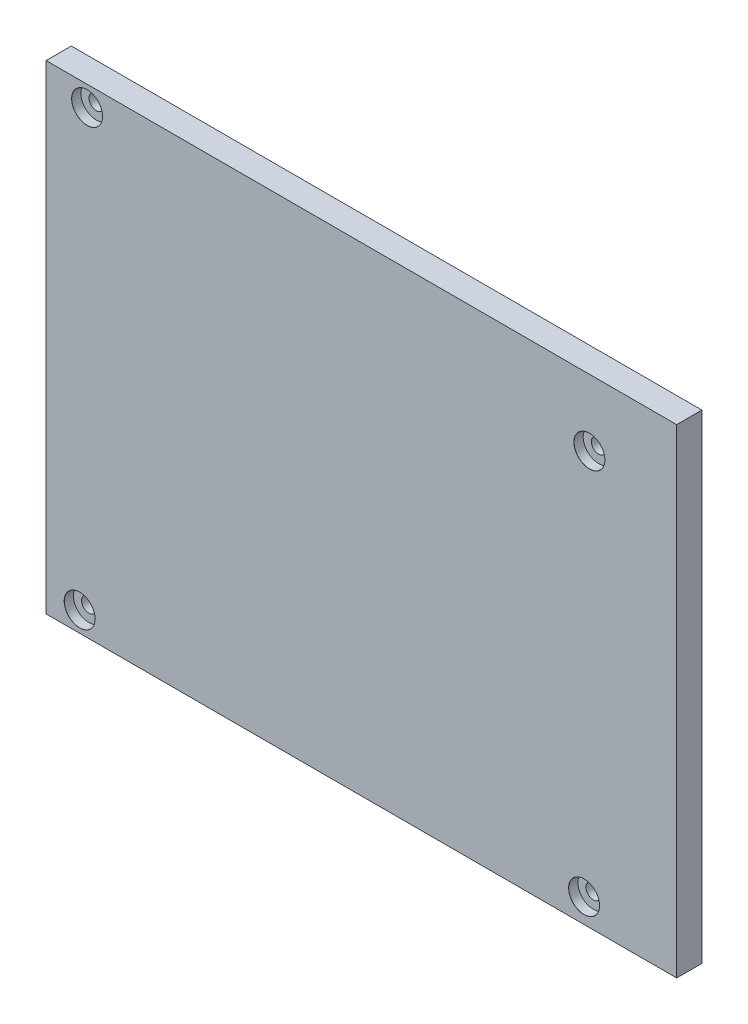
ISO-10303-21;
HEADER;
FILE_DESCRIPTION(('STEP AP214'),'2;1');
FILE_NAME('part.step','',(''),(''),'','','');
FILE_SCHEMA(('AUTOMOTIVE_DESIGN { 1 0 10303 214 1 1 1 1 }'));
ENDSEC;
DATA;
#1=APPLICATION_CONTEXT('core data for automotive mechanical design processes');
#2=APPLICATION_PROTOCOL_DEFINITION('international standard','automotive_design',2000,#1);
#3=PRODUCT_CONTEXT('',#1,'mechanical');
#4=PRODUCT('Part','Part','',(#3));
#5=PRODUCT_RELATED_PRODUCT_CATEGORY('part','',(#4));
#6=PRODUCT_DEFINITION_FORMATION('','',#4);
#7=PRODUCT_DEFINITION_CONTEXT('part definition',#1,'design');
#8=PRODUCT_DEFINITION('design','',#6,#7);
#9=PRODUCT_DEFINITION_SHAPE('','',#8);
#10=(LENGTH_UNIT() NAMED_UNIT(*) SI_UNIT(.MILLI.,.METRE.));
#11=(NAMED_UNIT(*) PLANE_ANGLE_UNIT() SI_UNIT($,.RADIAN.));
#12=(NAMED_UNIT(*) SI_UNIT($,.STERADIAN.) SOLID_ANGLE_UNIT());
#13=UNCERTAINTY_MEASURE_WITH_UNIT(LENGTH_MEASURE(1.E-05),#10,'distance_accuracy_value','');
#14=(GEOMETRIC_REPRESENTATION_CONTEXT(3) GLOBAL_UNCERTAINTY_ASSIGNED_CONTEXT((#13)) GLOBAL_UNIT_ASSIGNED_CONTEXT((#10,
#11,#12)) REPRESENTATION_CONTEXT('',''));
#15=CARTESIAN_POINT('',(0.,0.,0.));
#16=DIRECTION('',(0.,0.,1.));
#17=DIRECTION('',(1.,0.,0.));
#18=AXIS2_PLACEMENT_3D('',#15,#16,#17);
#19=CARTESIAN_POINT('',(125.,-86.5479278930491,10.));
#20=DIRECTION('',(-1.,0.,0.));
#21=DIRECTION('',(0.,-1.,0.));
#22=AXIS2_PLACEMENT_3D('',#19,#20,#21);
#23=PLANE('',#22);
#24=DIRECTION('',(0.,1.,0.));
#25=VECTOR('',#24,1.);
#26=CARTESIAN_POINT('',(125.,-86.5479278930491,0.));
#27=LINE('',#26,#25);
#28=CARTESIAN_POINT('',(125.,-86.5479278930491,0.));
#29=VERTEX_POINT('',#28);
#30=CARTESIAN_POINT('',(125.,103.452072106951,0.));
#31=VERTEX_POINT('',#30);
#32=EDGE_CURVE('E99',#29,#31,#27,.T.);
#33=ORIENTED_EDGE('',*,*,#32,.T.);
#34=DIRECTION('',(0.,0.,-1.));
#35=VECTOR('',#34,1.);
#36=CARTESIAN_POINT('',(125.,103.452072106951,10.));
#37=LINE('',#36,#35);
#38=CARTESIAN_POINT('',(125.,103.452072106951,10.));
#39=VERTEX_POINT('',#38);
#40=EDGE_CURVE('E11',#39,#31,#37,.T.);
#41=ORIENTED_EDGE('',*,*,#40,.F.);
#42=DIRECTION('',(0.,1.,0.));
#43=VECTOR('',#42,1.);
#44=CARTESIAN_POINT('',(125.,-86.5479278930491,10.));
#45=LINE('',#44,#43);
#46=CARTESIAN_POINT('',(125.,-86.5479278930491,10.));
#47=VERTEX_POINT('',#46);
#48=EDGE_CURVE('E87',#47,#39,#45,.T.);
#49=ORIENTED_EDGE('',*,*,#48,.F.);
#50=DIRECTION('',(0.,0.,-1.));
#51=VECTOR('',#50,1.);
#52=CARTESIAN_POINT('',(125.,-86.5479278930491,10.));
#53=LINE('',#52,#51);
#54=EDGE_CURVE('E95',#47,#29,#53,.T.);
#55=ORIENTED_EDGE('',*,*,#54,.T.);
#56=EDGE_LOOP('',(#33,#41,#49,#55));
#57=FACE_BOUND('',#56,.T.);
#58=ADVANCED_FACE('F36',(#57),#23,.F.);
#59=CARTESIAN_POINT('',(-125.,103.452072106951,10.));
#60=DIRECTION('',(0.,-1.,0.));
#61=DIRECTION('',(0.,0.,-1.));
#62=AXIS2_PLACEMENT_3D('',#59,#60,#61);
#63=PLANE('',#62);
#64=DIRECTION('',(-1.,0.,0.));
#65=VECTOR('',#64,1.);
#66=CARTESIAN_POINT('',(-125.,103.452072106951,0.));
#67=LINE('',#66,#65);
#68=CARTESIAN_POINT('',(-125.,103.452072106951,0.));
#69=VERTEX_POINT('',#68);
#70=EDGE_CURVE('E91',#31,#69,#67,.T.);
#71=ORIENTED_EDGE('',*,*,#70,.T.);
#72=DIRECTION('',(0.,0.,-1.));
#73=VECTOR('',#72,1.);
#74=CARTESIAN_POINT('',(-125.,103.452072106951,10.));
#75=LINE('',#74,#73);
#76=CARTESIAN_POINT('',(-125.,103.452072106951,10.));
#77=VERTEX_POINT('',#76);
#78=EDGE_CURVE('E44',#77,#69,#75,.T.);
#79=ORIENTED_EDGE('',*,*,#78,.F.);
#80=DIRECTION('',(-1.,0.,0.));
#81=VECTOR('',#80,1.);
#82=CARTESIAN_POINT('',(-125.,103.452072106951,10.));
#83=LINE('',#82,#81);
#84=EDGE_CURVE('E82',#39,#77,#83,.T.);
#85=ORIENTED_EDGE('',*,*,#84,.F.);
#86=ORIENTED_EDGE('',*,*,#40,.T.);
#87=EDGE_LOOP('',(#71,#79,#85,#86));
#88=FACE_BOUND('',#87,.T.);
#89=ADVANCED_FACE('F90',(#88),#63,.F.);
#90=CARTESIAN_POINT('',(-125.,-86.5479278930491,10.));
#91=DIRECTION('',(1.,0.,0.));
#92=DIRECTION('',(0.,0.,-1.));
#93=AXIS2_PLACEMENT_3D('',#90,#91,#92);
#94=PLANE('',#93);
#95=DIRECTION('',(0.,-1.,0.));
#96=VECTOR('',#95,1.);
#97=CARTESIAN_POINT('',(-125.,-86.5479278930491,0.));
#98=LINE('',#97,#96);
#99=CARTESIAN_POINT('',(-125.,-86.5479278930491,0.));
#100=VERTEX_POINT('',#99);
#101=EDGE_CURVE('E69',#69,#100,#98,.T.);
#102=ORIENTED_EDGE('',*,*,#101,.T.);
#103=DIRECTION('',(0.,0.,-1.));
#104=VECTOR('',#103,1.);
#105=CARTESIAN_POINT('',(-125.,-86.5479278930491,10.));
#106=LINE('',#105,#104);
#107=CARTESIAN_POINT('',(-125.,-86.5479278930491,10.));
#108=VERTEX_POINT('',#107);
#109=EDGE_CURVE('E92',#108,#100,#106,.T.);
#110=ORIENTED_EDGE('',*,*,#109,.F.);
#111=DIRECTION('',(0.,-1.,0.));
#112=VECTOR('',#111,1.);
#113=CARTESIAN_POINT('',(-125.,-86.5479278930491,10.));
#114=LINE('',#113,#112);
#115=EDGE_CURVE('E85',#77,#108,#114,.T.);
#116=ORIENTED_EDGE('',*,*,#115,.F.);
#117=ORIENTED_EDGE('',*,*,#78,.T.);
#118=EDGE_LOOP('',(#102,#110,#116,#117));
#119=FACE_BOUND('',#118,.T.);
#120=ADVANCED_FACE('F93',(#119),#94,.F.);
#121=CARTESIAN_POINT('',(-125.,-86.5479278930491,10.));
#122=DIRECTION('',(0.,1.,0.));
#123=DIRECTION('',(0.,0.,1.));
#124=AXIS2_PLACEMENT_3D('',#121,#122,#123);
#125=PLANE('',#124);
#126=DIRECTION('',(1.,0.,0.));
#127=VECTOR('',#126,1.);
#128=CARTESIAN_POINT('',(-125.,-86.5479278930491,0.));
#129=LINE('',#128,#127);
#130=EDGE_CURVE('E75',#100,#29,#129,.T.);
#131=ORIENTED_EDGE('',*,*,#130,.T.);
#132=ORIENTED_EDGE('',*,*,#54,.F.);
#133=DIRECTION('',(1.,0.,0.));
#134=VECTOR('',#133,1.);
#135=CARTESIAN_POINT('',(-125.,-86.5479278930491,10.));
#136=LINE('',#135,#134);
#137=EDGE_CURVE('E52',#108,#47,#136,.T.);
#138=ORIENTED_EDGE('',*,*,#137,.F.);
#139=ORIENTED_EDGE('',*,*,#109,.T.);
#140=EDGE_LOOP('',(#131,#132,#138,#139));
#141=FACE_BOUND('',#140,.T.);
#142=ADVANCED_FACE('F107',(#141),#125,.F.);
#143=CARTESIAN_POINT('',(0.,0.,10.));
#144=DIRECTION('',(0.,0.,-1.));
#145=DIRECTION('',(-1.,0.,0.));
#146=AXIS2_PLACEMENT_3D('',#143,#144,#145);
#147=PLANE('',#146);
#148=CARTESIAN_POINT('',(-108.749145677854,95.4520721069509,10.));
#149=DIRECTION('',(0.,0.,1.));
#150=DIRECTION('',(1.,0.,0.));
#151=AXIS2_PLACEMENT_3D('',#148,#149,#150);
#152=CIRCLE('',#151,6.145);
#153=CARTESIAN_POINT('',(-102.604145677854,95.4520721069509,10.));
#154=VERTEX_POINT('',#153);
#155=EDGE_CURVE('E169',#154,#154,#152,.T.);
#156=ORIENTED_EDGE('',*,*,#155,.F.);
#157=EDGE_LOOP('',(#156));
#158=FACE_BOUND('',#157,.T.);
#159=CARTESIAN_POINT('',(-111.700275818366,-78.5479278930491,10.));
#160=DIRECTION('',(0.,0.,1.));
#161=DIRECTION('',(1.,0.,0.));
#162=AXIS2_PLACEMENT_3D('',#159,#160,#161);
#163=CIRCLE('',#162,6.145);
#164=CARTESIAN_POINT('',(-105.555275818366,-78.5479278930491,10.));
#165=VERTEX_POINT('',#164);
#166=EDGE_CURVE('E154',#165,#165,#163,.T.);
#167=ORIENTED_EDGE('',*,*,#166,.F.);
#168=EDGE_LOOP('',(#167));
#169=FACE_BOUND('',#168,.T.);
#170=CARTESIAN_POINT('',(88.2937342488347,-77.0000463599203,10.));
#171=DIRECTION('',(0.,0.,1.));
#172=DIRECTION('',(1.,0.,0.));
#173=AXIS2_PLACEMENT_3D('',#170,#171,#172);
#174=CIRCLE('',#173,6.145);
#175=CARTESIAN_POINT('',(94.4387342488347,-77.0000463599203,10.));
#176=VERTEX_POINT('',#175);
#177=EDGE_CURVE('E139',#176,#176,#174,.T.);
#178=ORIENTED_EDGE('',*,*,#177,.F.);
#179=EDGE_LOOP('',(#178));
#180=FACE_BOUND('',#179,.T.);
#181=CARTESIAN_POINT('',(90.4050526769587,77.0780339647259,10.));
#182=DIRECTION('',(0.,0.,1.));
#183=DIRECTION('',(1.,0.,0.));
#184=AXIS2_PLACEMENT_3D('',#181,#182,#183);
#185=CIRCLE('',#184,6.145);
#186=CARTESIAN_POINT('',(96.5500526769587,77.0780339647259,10.));
#187=VERTEX_POINT('',#186);
#188=EDGE_CURVE('E124',#187,#187,#185,.T.);
#189=ORIENTED_EDGE('',*,*,#188,.F.);
#190=EDGE_LOOP('',(#189));
#191=FACE_BOUND('',#190,.T.);
#192=ORIENTED_EDGE('',*,*,#48,.T.);
#193=ORIENTED_EDGE('',*,*,#84,.T.);
#194=ORIENTED_EDGE('',*,*,#115,.T.);
#195=ORIENTED_EDGE('',*,*,#137,.T.);
#196=EDGE_LOOP('',(#192,#193,#194,#195));
#197=FACE_BOUND('',#196,.T.);
#198=ADVANCED_FACE('F83',(#158,#169,#180,#191,#197),#147,.F.);
#199=CARTESIAN_POINT('',(0.,0.,0.));
#200=DIRECTION('',(0.,0.,-1.));
#201=DIRECTION('',(-1.,0.,0.));
#202=AXIS2_PLACEMENT_3D('',#199,#200,#201);
#203=PLANE('',#202);
#204=CARTESIAN_POINT('',(-108.749145677854,95.4520721069509,0.));
#205=DIRECTION('',(0.,0.,1.));
#206=DIRECTION('',(1.,0.,0.));
#207=AXIS2_PLACEMENT_3D('',#204,#205,#206);
#208=CIRCLE('',#207,2.9);
#209=CARTESIAN_POINT('',(-105.849145677854,95.4520721069509,0.));
#210=VERTEX_POINT('',#209);
#211=EDGE_CURVE('E157',#210,#210,#208,.T.);
#212=ORIENTED_EDGE('',*,*,#211,.T.);
#213=EDGE_LOOP('',(#212));
#214=FACE_BOUND('',#213,.T.);
#215=CARTESIAN_POINT('',(-111.700275818366,-78.5479278930491,0.));
#216=DIRECTION('',(0.,0.,1.));
#217=DIRECTION('',(1.,0.,0.));
#218=AXIS2_PLACEMENT_3D('',#215,#216,#217);
#219=CIRCLE('',#218,2.9);
#220=CARTESIAN_POINT('',(-108.800275818366,-78.5479278930491,0.));
#221=VERTEX_POINT('',#220);
#222=EDGE_CURVE('E142',#221,#221,#219,.T.);
#223=ORIENTED_EDGE('',*,*,#222,.T.);
#224=EDGE_LOOP('',(#223));
#225=FACE_BOUND('',#224,.T.);
#226=CARTESIAN_POINT('',(88.2937342488347,-77.0000463599203,0.));
#227=DIRECTION('',(0.,0.,1.));
#228=DIRECTION('',(1.,0.,0.));
#229=AXIS2_PLACEMENT_3D('',#226,#227,#228);
#230=CIRCLE('',#229,2.9);
#231=CARTESIAN_POINT('',(91.1937342488347,-77.0000463599203,0.));
#232=VERTEX_POINT('',#231);
#233=EDGE_CURVE('E127',#232,#232,#230,.T.);
#234=ORIENTED_EDGE('',*,*,#233,.T.);
#235=EDGE_LOOP('',(#234));
#236=FACE_BOUND('',#235,.T.);
#237=CARTESIAN_POINT('',(90.4050526769587,77.0780339647259,0.));
#238=DIRECTION('',(0.,0.,1.));
#239=DIRECTION('',(1.,0.,0.));
#240=AXIS2_PLACEMENT_3D('',#237,#238,#239);
#241=CIRCLE('',#240,2.9);
#242=CARTESIAN_POINT('',(93.3050526769587,77.0780339647259,0.));
#243=VERTEX_POINT('',#242);
#244=EDGE_CURVE('E102',#243,#243,#241,.T.);
#245=ORIENTED_EDGE('',*,*,#244,.T.);
#246=EDGE_LOOP('',(#245));
#247=FACE_BOUND('',#246,.T.);
#248=ORIENTED_EDGE('',*,*,#32,.F.);
#249=ORIENTED_EDGE('',*,*,#130,.F.);
#250=ORIENTED_EDGE('',*,*,#101,.F.);
#251=ORIENTED_EDGE('',*,*,#70,.F.);
#252=EDGE_LOOP('',(#248,#249,#250,#251));
#253=FACE_BOUND('',#252,.T.);
#254=ADVANCED_FACE('F110',(#214,#225,#236,#247,#253),#203,.T.);
#255=CARTESIAN_POINT('',(90.4050526769587,77.0780339647259,10.));
#256=DIRECTION('',(0.,0.,1.));
#257=DIRECTION('',(1.,0.,0.));
#258=AXIS2_PLACEMENT_3D('',#255,#256,#257);
#259=CYLINDRICAL_SURFACE('',#258,2.9);
#260=ORIENTED_EDGE('',*,*,#244,.F.);
#261=EDGE_LOOP('',(#260));
#262=FACE_BOUND('',#261,.T.);
#263=CARTESIAN_POINT('',(90.4050526769587,77.0780339647259,6.35));
#264=DIRECTION('',(0.,0.,1.));
#265=DIRECTION('',(1.,0.,0.));
#266=AXIS2_PLACEMENT_3D('',#263,#264,#265);
#267=CIRCLE('',#266,2.9);
#268=CARTESIAN_POINT('',(93.3050526769587,77.0780339647259,6.35));
#269=VERTEX_POINT('',#268);
#270=EDGE_CURVE('E115',#269,#269,#267,.T.);
#271=ORIENTED_EDGE('',*,*,#270,.T.);
#272=EDGE_LOOP('',(#271));
#273=FACE_BOUND('',#272,.T.);
#274=ADVANCED_FACE('F213',(#262,#273),#259,.F.);
#275=CARTESIAN_POINT('',(96.5250526769587,77.0780339647259,6.35));
#276=DIRECTION('',(0.,0.,-1.));
#277=DIRECTION('',(-1.,0.,0.));
#278=AXIS2_PLACEMENT_3D('',#275,#276,#277);
#279=PLANE('',#278);
#280=ORIENTED_EDGE('',*,*,#270,.F.);
#281=EDGE_LOOP('',(#280));
#282=FACE_BOUND('',#281,.T.);
#283=CARTESIAN_POINT('',(90.4050526769587,77.0780339647259,6.35));
#284=DIRECTION('',(0.,0.,1.));
#285=DIRECTION('',(1.,0.,0.));
#286=AXIS2_PLACEMENT_3D('',#283,#284,#285);
#287=CIRCLE('',#286,6.12);
#288=CARTESIAN_POINT('',(96.5250526769587,77.0780339647259,6.35));
#289=VERTEX_POINT('',#288);
#290=EDGE_CURVE('E118',#289,#289,#287,.T.);
#291=ORIENTED_EDGE('',*,*,#290,.T.);
#292=EDGE_LOOP('',(#291));
#293=FACE_BOUND('',#292,.T.);
#294=ADVANCED_FACE('F197',(#282,#293),#279,.F.);
#295=CARTESIAN_POINT('',(90.4050526769587,77.0780339647259,10.));
#296=DIRECTION('',(0.,0.,1.));
#297=DIRECTION('',(1.,0.,0.));
#298=AXIS2_PLACEMENT_3D('',#295,#296,#297);
#299=CYLINDRICAL_SURFACE('',#298,6.12);
#300=ORIENTED_EDGE('',*,*,#290,.F.);
#301=EDGE_LOOP('',(#300));
#302=FACE_BOUND('',#301,.T.);
#303=CARTESIAN_POINT('',(90.4050526769587,77.0780339647259,9.975));
#304=DIRECTION('',(0.,0.,1.));
#305=DIRECTION('',(1.,0.,0.));
#306=AXIS2_PLACEMENT_3D('',#303,#304,#305);
#307=CIRCLE('',#306,6.12);
#308=CARTESIAN_POINT('',(96.5250526769587,77.0780339647259,9.975));
#309=VERTEX_POINT('',#308);
#310=EDGE_CURVE('E121',#309,#309,#307,.T.);
#311=ORIENTED_EDGE('',*,*,#310,.T.);
#312=EDGE_LOOP('',(#311));
#313=FACE_BOUND('',#312,.T.);
#314=ADVANCED_FACE('F187',(#302,#313),#299,.F.);
#315=CARTESIAN_POINT('',(90.4050526769587,77.0780339647259,10.));
#316=DIRECTION('',(0.,0.,1.));
#317=DIRECTION('',(1.,0.,0.));
#318=AXIS2_PLACEMENT_3D('',#315,#316,#317);
#319=CONICAL_SURFACE('',#318,6.145,0.785398163397344);
#320=ORIENTED_EDGE('',*,*,#310,.F.);
#321=EDGE_LOOP('',(#320));
#322=FACE_BOUND('',#321,.T.);
#323=ORIENTED_EDGE('',*,*,#188,.T.);
#324=EDGE_LOOP('',(#323));
#325=FACE_BOUND('',#324,.T.);
#326=ADVANCED_FACE('F184',(#322,#325),#319,.F.);
#327=CARTESIAN_POINT('',(88.2937342488347,-77.0000463599203,10.));
#328=DIRECTION('',(0.,0.,1.));
#329=DIRECTION('',(1.,0.,0.));
#330=AXIS2_PLACEMENT_3D('',#327,#328,#329);
#331=CYLINDRICAL_SURFACE('',#330,2.9);
#332=ORIENTED_EDGE('',*,*,#233,.F.);
#333=EDGE_LOOP('',(#332));
#334=FACE_BOUND('',#333,.T.);
#335=CARTESIAN_POINT('',(88.2937342488347,-77.0000463599203,6.35));
#336=DIRECTION('',(0.,0.,1.));
#337=DIRECTION('',(1.,0.,0.));
#338=AXIS2_PLACEMENT_3D('',#335,#336,#337);
#339=CIRCLE('',#338,2.9);
#340=CARTESIAN_POINT('',(91.1937342488347,-77.0000463599203,6.35));
#341=VERTEX_POINT('',#340);
#342=EDGE_CURVE('E130',#341,#341,#339,.T.);
#343=ORIENTED_EDGE('',*,*,#342,.T.);
#344=EDGE_LOOP('',(#343));
#345=FACE_BOUND('',#344,.T.);
#346=ADVANCED_FACE('F186',(#334,#345),#331,.F.);
#347=CARTESIAN_POINT('',(94.4137342488347,-77.0000463599203,6.35));
#348=DIRECTION('',(0.,0.,-1.));
#349=DIRECTION('',(-1.,0.,0.));
#350=AXIS2_PLACEMENT_3D('',#347,#348,#349);
#351=PLANE('',#350);
#352=ORIENTED_EDGE('',*,*,#342,.F.);
#353=EDGE_LOOP('',(#352));
#354=FACE_BOUND('',#353,.T.);
#355=CARTESIAN_POINT('',(88.2937342488347,-77.0000463599203,6.35));
#356=DIRECTION('',(0.,0.,1.));
#357=DIRECTION('',(1.,0.,0.));
#358=AXIS2_PLACEMENT_3D('',#355,#356,#357);
#359=CIRCLE('',#358,6.12);
#360=CARTESIAN_POINT('',(94.4137342488347,-77.0000463599203,6.35));
#361=VERTEX_POINT('',#360);
#362=EDGE_CURVE('E133',#361,#361,#359,.T.);
#363=ORIENTED_EDGE('',*,*,#362,.T.);
#364=EDGE_LOOP('',(#363));
#365=FACE_BOUND('',#364,.T.);
#366=ADVANCED_FACE('F194',(#354,#365),#351,.F.);
#367=CARTESIAN_POINT('',(88.2937342488347,-77.0000463599203,10.));
#368=DIRECTION('',(0.,0.,1.));
#369=DIRECTION('',(1.,0.,0.));
#370=AXIS2_PLACEMENT_3D('',#367,#368,#369);
#371=CYLINDRICAL_SURFACE('',#370,6.12);
#372=ORIENTED_EDGE('',*,*,#362,.F.);
#373=EDGE_LOOP('',(#372));
#374=FACE_BOUND('',#373,.T.);
#375=CARTESIAN_POINT('',(88.2937342488347,-77.0000463599203,9.975));
#376=DIRECTION('',(0.,0.,1.));
#377=DIRECTION('',(1.,0.,0.));
#378=AXIS2_PLACEMENT_3D('',#375,#376,#377);
#379=CIRCLE('',#378,6.12);
#380=CARTESIAN_POINT('',(94.4137342488347,-77.0000463599203,9.975));
#381=VERTEX_POINT('',#380);
#382=EDGE_CURVE('E136',#381,#381,#379,.T.);
#383=ORIENTED_EDGE('',*,*,#382,.T.);
#384=EDGE_LOOP('',(#383));
#385=FACE_BOUND('',#384,.T.);
#386=ADVANCED_FACE('F256',(#374,#385),#371,.F.);
#387=CARTESIAN_POINT('',(88.2937342488347,-77.0000463599203,10.));
#388=DIRECTION('',(0.,0.,1.));
#389=DIRECTION('',(1.,0.,0.));
#390=AXIS2_PLACEMENT_3D('',#387,#388,#389);
#391=CONICAL_SURFACE('',#390,6.145,0.785398163397344);
#392=ORIENTED_EDGE('',*,*,#382,.F.);
#393=EDGE_LOOP('',(#392));
#394=FACE_BOUND('',#393,.T.);
#395=ORIENTED_EDGE('',*,*,#177,.T.);
#396=EDGE_LOOP('',(#395));
#397=FACE_BOUND('',#396,.T.);
#398=ADVANCED_FACE('F267',(#394,#397),#391,.F.);
#399=CARTESIAN_POINT('',(-111.700275818366,-78.5479278930491,10.));
#400=DIRECTION('',(0.,0.,1.));
#401=DIRECTION('',(1.,0.,0.));
#402=AXIS2_PLACEMENT_3D('',#399,#400,#401);
#403=CYLINDRICAL_SURFACE('',#402,2.9);
#404=ORIENTED_EDGE('',*,*,#222,.F.);
#405=EDGE_LOOP('',(#404));
#406=FACE_BOUND('',#405,.T.);
#407=CARTESIAN_POINT('',(-111.700275818366,-78.5479278930491,6.35));
#408=DIRECTION('',(0.,0.,1.));
#409=DIRECTION('',(1.,0.,0.));
#410=AXIS2_PLACEMENT_3D('',#407,#408,#409);
#411=CIRCLE('',#410,2.9);
#412=CARTESIAN_POINT('',(-108.800275818366,-78.5479278930491,6.35));
#413=VERTEX_POINT('',#412);
#414=EDGE_CURVE('E145',#413,#413,#411,.T.);
#415=ORIENTED_EDGE('',*,*,#414,.T.);
#416=EDGE_LOOP('',(#415));
#417=FACE_BOUND('',#416,.T.);
#418=ADVANCED_FACE('F278',(#406,#417),#403,.F.);
#419=CARTESIAN_POINT('',(-105.580275818366,-78.5479278930491,6.35));
#420=DIRECTION('',(0.,0.,-1.));
#421=DIRECTION('',(-1.,0.,0.));
#422=AXIS2_PLACEMENT_3D('',#419,#420,#421);
#423=PLANE('',#422);
#424=ORIENTED_EDGE('',*,*,#414,.F.);
#425=EDGE_LOOP('',(#424));
#426=FACE_BOUND('',#425,.T.);
#427=CARTESIAN_POINT('',(-111.700275818366,-78.5479278930491,6.35));
#428=DIRECTION('',(0.,0.,1.));
#429=DIRECTION('',(1.,0.,0.));
#430=AXIS2_PLACEMENT_3D('',#427,#428,#429);
#431=CIRCLE('',#430,6.12);
#432=CARTESIAN_POINT('',(-105.580275818366,-78.5479278930491,6.35));
#433=VERTEX_POINT('',#432);
#434=EDGE_CURVE('E148',#433,#433,#431,.T.);
#435=ORIENTED_EDGE('',*,*,#434,.T.);
#436=EDGE_LOOP('',(#435));
#437=FACE_BOUND('',#436,.T.);
#438=ADVANCED_FACE('F289',(#426,#437),#423,.F.);
#439=CARTESIAN_POINT('',(-111.700275818366,-78.5479278930491,10.));
#440=DIRECTION('',(0.,0.,1.));
#441=DIRECTION('',(1.,0.,0.));
#442=AXIS2_PLACEMENT_3D('',#439,#440,#441);
#443=CYLINDRICAL_SURFACE('',#442,6.12);
#444=ORIENTED_EDGE('',*,*,#434,.F.);
#445=EDGE_LOOP('',(#444));
#446=FACE_BOUND('',#445,.T.);
#447=CARTESIAN_POINT('',(-111.700275818366,-78.5479278930491,9.975));
#448=DIRECTION('',(0.,0.,1.));
#449=DIRECTION('',(1.,0.,0.));
#450=AXIS2_PLACEMENT_3D('',#447,#448,#449);
#451=CIRCLE('',#450,6.12);
#452=CARTESIAN_POINT('',(-105.580275818366,-78.5479278930491,9.975));
#453=VERTEX_POINT('',#452);
#454=EDGE_CURVE('E151',#453,#453,#451,.T.);
#455=ORIENTED_EDGE('',*,*,#454,.T.);
#456=EDGE_LOOP('',(#455));
#457=FACE_BOUND('',#456,.T.);
#458=ADVANCED_FACE('F300',(#446,#457),#443,.F.);
#459=CARTESIAN_POINT('',(-111.700275818366,-78.5479278930491,10.));
#460=DIRECTION('',(0.,0.,1.));
#461=DIRECTION('',(1.,0.,0.));
#462=AXIS2_PLACEMENT_3D('',#459,#460,#461);
#463=CONICAL_SURFACE('',#462,6.145,0.785398163397344);
#464=ORIENTED_EDGE('',*,*,#454,.F.);
#465=EDGE_LOOP('',(#464));
#466=FACE_BOUND('',#465,.T.);
#467=ORIENTED_EDGE('',*,*,#166,.T.);
#468=EDGE_LOOP('',(#467));
#469=FACE_BOUND('',#468,.T.);
#470=ADVANCED_FACE('F311',(#466,#469),#463,.F.);
#471=CARTESIAN_POINT('',(-108.749145677854,95.4520721069509,10.));
#472=DIRECTION('',(0.,0.,1.));
#473=DIRECTION('',(1.,0.,0.));
#474=AXIS2_PLACEMENT_3D('',#471,#472,#473);
#475=CYLINDRICAL_SURFACE('',#474,2.9);
#476=ORIENTED_EDGE('',*,*,#211,.F.);
#477=EDGE_LOOP('',(#476));
#478=FACE_BOUND('',#477,.T.);
#479=CARTESIAN_POINT('',(-108.749145677854,95.4520721069509,6.35));
#480=DIRECTION('',(0.,0.,1.));
#481=DIRECTION('',(1.,0.,0.));
#482=AXIS2_PLACEMENT_3D('',#479,#480,#481);
#483=CIRCLE('',#482,2.9);
#484=CARTESIAN_POINT('',(-105.849145677854,95.4520721069509,6.35));
#485=VERTEX_POINT('',#484);
#486=EDGE_CURVE('E160',#485,#485,#483,.T.);
#487=ORIENTED_EDGE('',*,*,#486,.T.);
#488=EDGE_LOOP('',(#487));
#489=FACE_BOUND('',#488,.T.);
#490=ADVANCED_FACE('F322',(#478,#489),#475,.F.);
#491=CARTESIAN_POINT('',(-102.629145677854,95.4520721069509,6.35));
#492=DIRECTION('',(0.,0.,-1.));
#493=DIRECTION('',(-1.,0.,0.));
#494=AXIS2_PLACEMENT_3D('',#491,#492,#493);
#495=PLANE('',#494);
#496=ORIENTED_EDGE('',*,*,#486,.F.);
#497=EDGE_LOOP('',(#496));
#498=FACE_BOUND('',#497,.T.);
#499=CARTESIAN_POINT('',(-108.749145677854,95.4520721069509,6.35));
#500=DIRECTION('',(0.,0.,1.));
#501=DIRECTION('',(1.,0.,0.));
#502=AXIS2_PLACEMENT_3D('',#499,#500,#501);
#503=CIRCLE('',#502,6.12);
#504=CARTESIAN_POINT('',(-102.629145677854,95.4520721069509,6.35));
#505=VERTEX_POINT('',#504);
#506=EDGE_CURVE('E163',#505,#505,#503,.T.);
#507=ORIENTED_EDGE('',*,*,#506,.T.);
#508=EDGE_LOOP('',(#507));
#509=FACE_BOUND('',#508,.T.);
#510=ADVANCED_FACE('F333',(#498,#509),#495,.F.);
#511=CARTESIAN_POINT('',(-108.749145677854,95.4520721069509,10.));
#512=DIRECTION('',(0.,0.,1.));
#513=DIRECTION('',(1.,0.,0.));
#514=AXIS2_PLACEMENT_3D('',#511,#512,#513);
#515=CYLINDRICAL_SURFACE('',#514,6.12);
#516=ORIENTED_EDGE('',*,*,#506,.F.);
#517=EDGE_LOOP('',(#516));
#518=FACE_BOUND('',#517,.T.);
#519=CARTESIAN_POINT('',(-108.749145677854,95.4520721069509,9.975));
#520=DIRECTION('',(0.,0.,1.));
#521=DIRECTION('',(1.,0.,0.));
#522=AXIS2_PLACEMENT_3D('',#519,#520,#521);
#523=CIRCLE('',#522,6.12);
#524=CARTESIAN_POINT('',(-102.629145677854,95.4520721069509,9.975));
#525=VERTEX_POINT('',#524);
#526=EDGE_CURVE('E166',#525,#525,#523,.T.);
#527=ORIENTED_EDGE('',*,*,#526,.T.);
#528=EDGE_LOOP('',(#527));
#529=FACE_BOUND('',#528,.T.);
#530=ADVANCED_FACE('F344',(#518,#529),#515,.F.);
#531=CARTESIAN_POINT('',(-108.749145677854,95.4520721069509,10.));
#532=DIRECTION('',(0.,0.,1.));
#533=DIRECTION('',(1.,0.,0.));
#534=AXIS2_PLACEMENT_3D('',#531,#532,#533);
#535=CONICAL_SURFACE('',#534,6.145,0.785398163397344);
#536=ORIENTED_EDGE('',*,*,#526,.F.);
#537=EDGE_LOOP('',(#536));
#538=FACE_BOUND('',#537,.T.);
#539=ORIENTED_EDGE('',*,*,#155,.T.);
#540=EDGE_LOOP('',(#539));
#541=FACE_BOUND('',#540,.T.);
#542=ADVANCED_FACE('F173',(#538,#541),#535,.F.);
#543=CLOSED_SHELL('',(#58,#89,#120,#142,#198,#254,#274,#294,#314,#326,#346,#366,#386,#398,#418,
#438,#458,#470,#490,#510,#530,#542));
#544=MANIFOLD_SOLID_BREP('B2',#543);
#545=ADVANCED_BREP_SHAPE_REPRESENTATION('',(#18,#544),#14);
#546=SHAPE_DEFINITION_REPRESENTATION(#9,#545);
ENDSEC;
END-ISO-10303-21;
